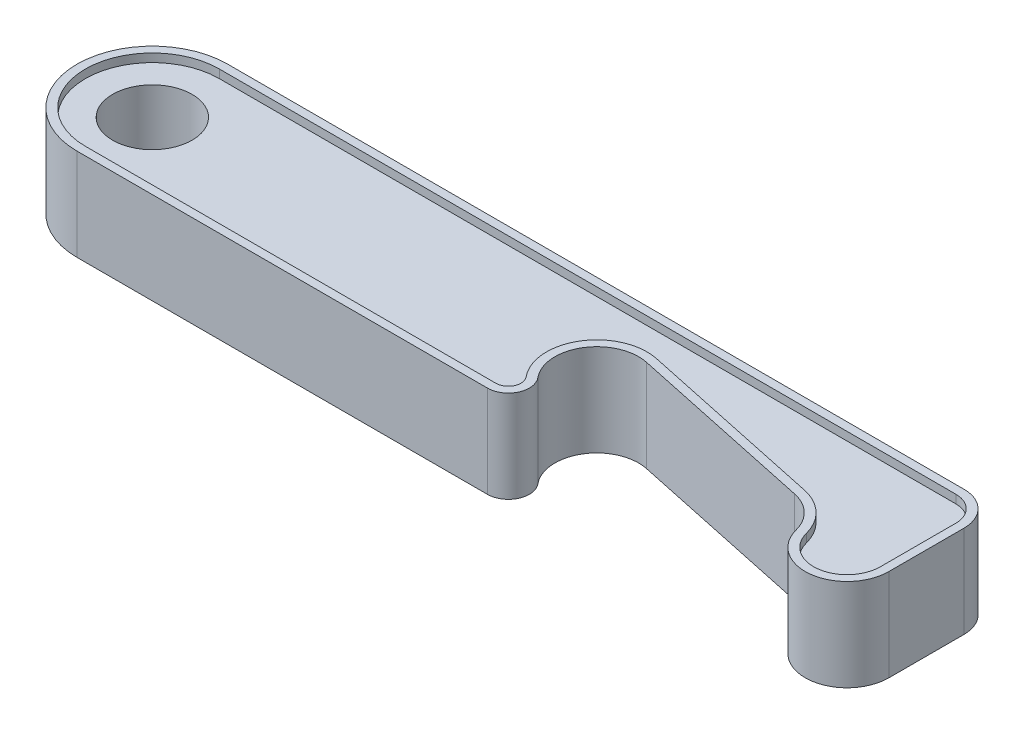
ISO-10303-21;
HEADER;
FILE_DESCRIPTION(('STEP AP214'),'2;1');
FILE_NAME('part.step','',(''),(''),'','','');
FILE_SCHEMA(('AUTOMOTIVE_DESIGN { 1 0 10303 214 1 1 1 1 }'));
ENDSEC;
DATA;
#1=APPLICATION_CONTEXT('core data for automotive mechanical design processes');
#2=APPLICATION_PROTOCOL_DEFINITION('international standard','automotive_design',2000,#1);
#3=PRODUCT_CONTEXT('',#1,'mechanical');
#4=PRODUCT('Part','Part','',(#3));
#5=PRODUCT_RELATED_PRODUCT_CATEGORY('part','',(#4));
#6=PRODUCT_DEFINITION_FORMATION('','',#4);
#7=PRODUCT_DEFINITION_CONTEXT('part definition',#1,'design');
#8=PRODUCT_DEFINITION('design','',#6,#7);
#9=PRODUCT_DEFINITION_SHAPE('','',#8);
#10=(LENGTH_UNIT() NAMED_UNIT(*) SI_UNIT(.MILLI.,.METRE.));
#11=(NAMED_UNIT(*) PLANE_ANGLE_UNIT() SI_UNIT($,.RADIAN.));
#12=(NAMED_UNIT(*) SI_UNIT($,.STERADIAN.) SOLID_ANGLE_UNIT());
#13=UNCERTAINTY_MEASURE_WITH_UNIT(LENGTH_MEASURE(1.E-05),#10,'distance_accuracy_value','');
#14=(GEOMETRIC_REPRESENTATION_CONTEXT(3) GLOBAL_UNCERTAINTY_ASSIGNED_CONTEXT((#13)) GLOBAL_UNIT_ASSIGNED_CONTEXT((#10,
#11,#12)) REPRESENTATION_CONTEXT('',''));
#15=CARTESIAN_POINT('',(0.,0.,0.));
#16=DIRECTION('',(0.,0.,1.));
#17=DIRECTION('',(1.,0.,0.));
#18=AXIS2_PLACEMENT_3D('',#15,#16,#17);
#19=CARTESIAN_POINT('',(0.,9.,0.));
#20=DIRECTION('',(0.,1.,0.));
#21=DIRECTION('',(0.,0.,1.));
#22=AXIS2_PLACEMENT_3D('',#19,#20,#21);
#23=PLANE('',#22);
#24=CARTESIAN_POINT('',(0.,9.,0.));
#25=DIRECTION('',(0.,1.,0.));
#26=DIRECTION('',(0.,0.,1.));
#27=AXIS2_PLACEMENT_3D('',#24,#25,#26);
#28=CIRCLE('',#27,8.);
#29=CARTESIAN_POINT('',(0.,9.,-8.));
#30=VERTEX_POINT('',#29);
#31=CARTESIAN_POINT('',(0.,9.,8.));
#32=VERTEX_POINT('',#31);
#33=EDGE_CURVE('E67',#30,#32,#28,.T.);
#34=ORIENTED_EDGE('',*,*,#33,.T.);
#35=DIRECTION('',(1.,0.,0.));
#36=VECTOR('',#35,1.);
#37=CARTESIAN_POINT('',(0.,9.,8.));
#38=LINE('',#37,#36);
#39=CARTESIAN_POINT('',(49.0402172346336,9.,8.));
#40=VERTEX_POINT('',#39);
#41=EDGE_CURVE('E428',#32,#40,#38,.T.);
#42=ORIENTED_EDGE('',*,*,#41,.T.);
#43=CARTESIAN_POINT('',(49.0402172346336,9.,6.5));
#44=DIRECTION('',(0.,1.,0.));
#45=DIRECTION('',(0.,0.,1.));
#46=AXIS2_PLACEMENT_3D('',#43,#44,#45);
#47=CIRCLE('',#46,1.5);
#48=CARTESIAN_POINT('',(50.1956821146032,9.,5.54349547248489));
#49=VERTEX_POINT('',#48);
#50=EDGE_CURVE('E431',#40,#49,#47,.T.);
#51=ORIENTED_EDGE('',*,*,#50,.T.);
#52=CARTESIAN_POINT('',(54.8175416344815,9.,1.71747736242449));
#53=DIRECTION('',(0.,-1.,0.));
#54=DIRECTION('',(0.,0.,1.));
#55=AXIS2_PLACEMENT_3D('',#52,#53,#54);
#56=CIRCLE('',#55,6.);
#57=CARTESIAN_POINT('',(56.065011779388,9.,-4.15140824197835));
#58=VERTEX_POINT('',#57);
#59=EDGE_CURVE('E434',#49,#58,#56,.T.);
#60=ORIENTED_EDGE('',*,*,#59,.T.);
#61=DIRECTION('',(0.978147600733805,0.,0.20791169081776));
#62=VECTOR('',#61,1.);
#63=CARTESIAN_POINT('',(56.065011779388,9.,-4.15140824197835));
#64=LINE('',#63,#62);
#65=CARTESIAN_POINT('',(78.565011779388,9.,0.631114395597159));
#66=VERTEX_POINT('',#65);
#67=EDGE_CURVE('E437',#58,#66,#64,.T.);
#68=ORIENTED_EDGE('',*,*,#67,.T.);
#69=CARTESIAN_POINT('',(77.3175416344815,9.,6.49999999999999));
#70=DIRECTION('',(0.,-1.,0.));
#71=DIRECTION('',(0.,0.,1.));
#72=AXIS2_PLACEMENT_3D('',#69,#70,#71);
#73=CIRCLE('',#72,6.);
#74=CARTESIAN_POINT('',(83.1270166537926,9.,4.99999999999999));
#75=VERTEX_POINT('',#74);
#76=EDGE_CURVE('E440',#66,#75,#73,.T.);
#77=ORIENTED_EDGE('',*,*,#76,.T.);
#78=CARTESIAN_POINT('',(87.,9.,4.));
#79=DIRECTION('',(0.,1.,0.));
#80=DIRECTION('',(0.,0.,1.));
#81=AXIS2_PLACEMENT_3D('',#78,#79,#80);
#82=CIRCLE('',#81,4.);
#83=CARTESIAN_POINT('',(91.,9.,4.));
#84=VERTEX_POINT('',#83);
#85=EDGE_CURVE('E443',#75,#84,#82,.T.);
#86=ORIENTED_EDGE('',*,*,#85,.T.);
#87=DIRECTION('',(0.,0.,-1.));
#88=VECTOR('',#87,1.);
#89=CARTESIAN_POINT('',(91.,9.,4.));
#90=LINE('',#89,#88);
#91=CARTESIAN_POINT('',(91.,9.,-5.));
#92=VERTEX_POINT('',#91);
#93=EDGE_CURVE('E446',#84,#92,#90,.T.);
#94=ORIENTED_EDGE('',*,*,#93,.T.);
#95=CARTESIAN_POINT('',(88.,9.,-5.));
#96=DIRECTION('',(0.,1.,0.));
#97=DIRECTION('',(0.,0.,1.));
#98=AXIS2_PLACEMENT_3D('',#95,#96,#97);
#99=CIRCLE('',#98,3.);
#100=CARTESIAN_POINT('',(88.,9.,-8.));
#101=VERTEX_POINT('',#100);
#102=EDGE_CURVE('E449',#92,#101,#99,.T.);
#103=ORIENTED_EDGE('',*,*,#102,.T.);
#104=DIRECTION('',(-1.,0.,0.));
#105=VECTOR('',#104,1.);
#106=CARTESIAN_POINT('',(88.,9.,-8.));
#107=LINE('',#106,#105);
#108=EDGE_CURVE('E397',#101,#30,#107,.T.);
#109=ORIENTED_EDGE('',*,*,#108,.T.);
#110=EDGE_LOOP('',(#34,#42,#51,#60,#68,#77,#86,#94,#103,#109));
#111=FACE_BOUND('',#110,.T.);
#112=CARTESIAN_POINT('',(0.,9.,0.));
#113=DIRECTION('',(0.,1.,0.));
#114=DIRECTION('',(0.,0.,1.));
#115=AXIS2_PLACEMENT_3D('',#112,#113,#114);
#116=CIRCLE('',#115,4.75);
#117=CARTESIAN_POINT('',(0.,9.,4.75));
#118=VERTEX_POINT('',#117);
#119=EDGE_CURVE('E534',#118,#118,#116,.T.);
#120=ORIENTED_EDGE('',*,*,#119,.F.);
#121=EDGE_LOOP('',(#120));
#122=FACE_BOUND('',#121,.T.);
#123=ADVANCED_FACE('F43',(#111,#122),#23,.T.);
#124=CARTESIAN_POINT('',(0.,0.,0.));
#125=DIRECTION('',(0.,1.,0.));
#126=DIRECTION('',(0.,0.,1.));
#127=AXIS2_PLACEMENT_3D('',#124,#125,#126);
#128=PLANE('',#127);
#129=DIRECTION('',(-1.,0.,0.));
#130=VECTOR('',#129,1.);
#131=CARTESIAN_POINT('',(49.0402172346336,0.,8.));
#132=LINE('',#131,#130);
#133=CARTESIAN_POINT('',(49.0402172346336,0.,8.));
#134=VERTEX_POINT('',#133);
#135=CARTESIAN_POINT('',(0.,0.,8.));
#136=VERTEX_POINT('',#135);
#137=EDGE_CURVE('E251',#134,#136,#132,.T.);
#138=ORIENTED_EDGE('',*,*,#137,.T.);
#139=CARTESIAN_POINT('',(0.,0.,0.));
#140=DIRECTION('',(0.,-1.,0.));
#141=DIRECTION('',(0.,0.,-1.));
#142=AXIS2_PLACEMENT_3D('',#139,#140,#141);
#143=CIRCLE('',#142,8.);
#144=CARTESIAN_POINT('',(0.,0.,-8.));
#145=VERTEX_POINT('',#144);
#146=EDGE_CURVE('E293',#136,#145,#143,.T.);
#147=ORIENTED_EDGE('',*,*,#146,.T.);
#148=DIRECTION('',(1.,0.,0.));
#149=VECTOR('',#148,1.);
#150=CARTESIAN_POINT('',(0.,0.,-8.));
#151=LINE('',#150,#149);
#152=CARTESIAN_POINT('',(88.,0.,-8.));
#153=VERTEX_POINT('',#152);
#154=EDGE_CURVE('E257',#145,#153,#151,.T.);
#155=ORIENTED_EDGE('',*,*,#154,.T.);
#156=CARTESIAN_POINT('',(88.,0.,-5.));
#157=DIRECTION('',(0.,-1.,0.));
#158=DIRECTION('',(0.,0.,-1.));
#159=AXIS2_PLACEMENT_3D('',#156,#157,#158);
#160=CIRCLE('',#159,3.);
#161=CARTESIAN_POINT('',(91.,0.,-5.));
#162=VERTEX_POINT('',#161);
#163=EDGE_CURVE('E298',#153,#162,#160,.T.);
#164=ORIENTED_EDGE('',*,*,#163,.T.);
#165=DIRECTION('',(0.,0.,1.));
#166=VECTOR('',#165,1.);
#167=CARTESIAN_POINT('',(91.,0.,-5.));
#168=LINE('',#167,#166);
#169=CARTESIAN_POINT('',(91.,0.,4.));
#170=VERTEX_POINT('',#169);
#171=EDGE_CURVE('E302',#162,#170,#168,.T.);
#172=ORIENTED_EDGE('',*,*,#171,.T.);
#173=CARTESIAN_POINT('',(87.,0.,4.));
#174=DIRECTION('',(0.,-1.,0.));
#175=DIRECTION('',(0.,0.,-1.));
#176=AXIS2_PLACEMENT_3D('',#173,#174,#175);
#177=CIRCLE('',#176,4.);
#178=CARTESIAN_POINT('',(83.1270166537926,0.,5.));
#179=VERTEX_POINT('',#178);
#180=EDGE_CURVE('E306',#170,#179,#177,.T.);
#181=ORIENTED_EDGE('',*,*,#180,.T.);
#182=CARTESIAN_POINT('',(77.3175416344815,0.,6.49999999999999));
#183=DIRECTION('',(0.,1.,0.));
#184=DIRECTION('',(0.,0.,-1.));
#185=AXIS2_PLACEMENT_3D('',#182,#183,#184);
#186=CIRCLE('',#185,5.99999999999999);
#187=CARTESIAN_POINT('',(78.565011779388,0.,0.631114395597162));
#188=VERTEX_POINT('',#187);
#189=EDGE_CURVE('E310',#179,#188,#186,.T.);
#190=ORIENTED_EDGE('',*,*,#189,.T.);
#191=DIRECTION('',(-0.978147600733805,0.,-0.20791169081776));
#192=VECTOR('',#191,1.);
#193=CARTESIAN_POINT('',(78.565011779388,0.,0.631114395597162));
#194=LINE('',#193,#192);
#195=CARTESIAN_POINT('',(56.065011779388,0.,-4.15140824197835));
#196=VERTEX_POINT('',#195);
#197=EDGE_CURVE('E314',#188,#196,#194,.T.);
#198=ORIENTED_EDGE('',*,*,#197,.T.);
#199=CARTESIAN_POINT('',(54.8175416344815,0.,1.71747736242449));
#200=DIRECTION('',(0.,1.,0.));
#201=DIRECTION('',(0.,0.,-1.));
#202=AXIS2_PLACEMENT_3D('',#199,#200,#201);
#203=CIRCLE('',#202,6.);
#204=CARTESIAN_POINT('',(50.1956821146032,0.,5.5434954724849));
#205=VERTEX_POINT('',#204);
#206=EDGE_CURVE('E318',#196,#205,#203,.T.);
#207=ORIENTED_EDGE('',*,*,#206,.T.);
#208=CARTESIAN_POINT('',(49.0402172346336,0.,6.5));
#209=DIRECTION('',(0.,-1.,0.));
#210=DIRECTION('',(0.,0.,-1.));
#211=AXIS2_PLACEMENT_3D('',#208,#209,#210);
#212=CIRCLE('',#211,1.5);
#213=EDGE_CURVE('E322',#205,#134,#212,.T.);
#214=ORIENTED_EDGE('',*,*,#213,.T.);
#215=EDGE_LOOP('',(#138,#147,#155,#164,#172,#181,#190,#198,#207,#214));
#216=FACE_BOUND('',#215,.T.);
#217=CARTESIAN_POINT('',(0.,0.,0.));
#218=DIRECTION('',(0.,1.,0.));
#219=DIRECTION('',(0.,0.,1.));
#220=AXIS2_PLACEMENT_3D('',#217,#218,#219);
#221=CIRCLE('',#220,4.75);
#222=CARTESIAN_POINT('',(0.,0.,4.75));
#223=VERTEX_POINT('',#222);
#224=EDGE_CURVE('E533',#223,#223,#221,.T.);
#225=ORIENTED_EDGE('',*,*,#224,.T.);
#226=EDGE_LOOP('',(#225));
#227=FACE_BOUND('',#226,.T.);
#228=ADVANCED_FACE('F617',(#216,#227),#128,.F.);
#229=CARTESIAN_POINT('',(0.,9.,0.));
#230=DIRECTION('',(0.,-1.,0.));
#231=DIRECTION('',(0.,0.,-1.));
#232=AXIS2_PLACEMENT_3D('',#229,#230,#231);
#233=CYLINDRICAL_SURFACE('',#232,9.);
#234=DIRECTION('',(0.,-1.,0.));
#235=VECTOR('',#234,1.);
#236=CARTESIAN_POINT('',(0.,9.,-9.));
#237=LINE('',#236,#235);
#238=CARTESIAN_POINT('',(0.,10.,-9.));
#239=VERTEX_POINT('',#238);
#240=CARTESIAN_POINT('',(0.,-1.,-9.));
#241=VERTEX_POINT('',#240);
#242=EDGE_CURVE('E538',#239,#241,#237,.T.);
#243=ORIENTED_EDGE('',*,*,#242,.T.);
#244=CARTESIAN_POINT('',(0.,-1.,0.));
#245=DIRECTION('',(0.,-1.,0.));
#246=DIRECTION('',(0.,0.,-1.));
#247=AXIS2_PLACEMENT_3D('',#244,#245,#246);
#248=CIRCLE('',#247,9.);
#249=CARTESIAN_POINT('',(0.,-1.,9.));
#250=VERTEX_POINT('',#249);
#251=EDGE_CURVE('E365',#250,#241,#248,.T.);
#252=ORIENTED_EDGE('',*,*,#251,.F.);
#253=DIRECTION('',(0.,-1.,0.));
#254=VECTOR('',#253,1.);
#255=CARTESIAN_POINT('',(0.,9.,9.));
#256=LINE('',#255,#254);
#257=CARTESIAN_POINT('',(0.,10.,9.));
#258=VERTEX_POINT('',#257);
#259=EDGE_CURVE('E11',#258,#250,#256,.T.);
#260=ORIENTED_EDGE('',*,*,#259,.F.);
#261=CARTESIAN_POINT('',(0.,10.,0.));
#262=DIRECTION('',(0.,1.,0.));
#263=DIRECTION('',(0.,0.,1.));
#264=AXIS2_PLACEMENT_3D('',#261,#262,#263);
#265=CIRCLE('',#264,9.);
#266=EDGE_CURVE('E501',#239,#258,#265,.T.);
#267=ORIENTED_EDGE('',*,*,#266,.F.);
#268=EDGE_LOOP('',(#243,#252,#260,#267));
#269=FACE_BOUND('',#268,.T.);
#270=ADVANCED_FACE('F45',(#269),#233,.T.);
#271=CARTESIAN_POINT('',(0.,9.,9.));
#272=DIRECTION('',(0.,0.,-1.));
#273=DIRECTION('',(-1.,0.,0.));
#274=AXIS2_PLACEMENT_3D('',#271,#272,#273);
#275=PLANE('',#274);
#276=ORIENTED_EDGE('',*,*,#259,.T.);
#277=DIRECTION('',(-1.,0.,0.));
#278=VECTOR('',#277,1.);
#279=CARTESIAN_POINT('',(0.,-1.,9.));
#280=LINE('',#279,#278);
#281=CARTESIAN_POINT('',(49.0402172346336,-1.,9.));
#282=VERTEX_POINT('',#281);
#283=EDGE_CURVE('E361',#282,#250,#280,.T.);
#284=ORIENTED_EDGE('',*,*,#283,.F.);
#285=DIRECTION('',(0.,-1.,0.));
#286=VECTOR('',#285,1.);
#287=CARTESIAN_POINT('',(49.0402172346336,9.,9.));
#288=LINE('',#287,#286);
#289=CARTESIAN_POINT('',(49.0402172346336,10.,9.));
#290=VERTEX_POINT('',#289);
#291=EDGE_CURVE('E52',#290,#282,#288,.T.);
#292=ORIENTED_EDGE('',*,*,#291,.F.);
#293=DIRECTION('',(1.,0.,0.));
#294=VECTOR('',#293,1.);
#295=CARTESIAN_POINT('',(0.,10.,9.));
#296=LINE('',#295,#294);
#297=EDGE_CURVE('E505',#258,#290,#296,.T.);
#298=ORIENTED_EDGE('',*,*,#297,.F.);
#299=EDGE_LOOP('',(#276,#284,#292,#298));
#300=FACE_BOUND('',#299,.T.);
#301=ADVANCED_FACE('F575',(#300),#275,.F.);
#302=CARTESIAN_POINT('',(49.0402172346336,9.,6.5));
#303=DIRECTION('',(0.,-1.,0.));
#304=DIRECTION('',(0.,0.,-1.));
#305=AXIS2_PLACEMENT_3D('',#302,#303,#304);
#306=CYLINDRICAL_SURFACE('',#305,2.5);
#307=ORIENTED_EDGE('',*,*,#291,.T.);
#308=CARTESIAN_POINT('',(49.0402172346336,-1.,6.5));
#309=DIRECTION('',(0.,-1.,0.));
#310=DIRECTION('',(0.,0.,-1.));
#311=AXIS2_PLACEMENT_3D('',#308,#309,#310);
#312=CIRCLE('',#311,2.5);
#313=CARTESIAN_POINT('',(50.9659920345829,-1.,4.90582578747483));
#314=VERTEX_POINT('',#313);
#315=EDGE_CURVE('E357',#314,#282,#312,.T.);
#316=ORIENTED_EDGE('',*,*,#315,.F.);
#317=DIRECTION('',(0.,-1.,0.));
#318=VECTOR('',#317,1.);
#319=CARTESIAN_POINT('',(50.9659920345829,9.,4.90582578747483));
#320=LINE('',#319,#318);
#321=CARTESIAN_POINT('',(50.9659920345829,10.,4.90582578747483));
#322=VERTEX_POINT('',#321);
#323=EDGE_CURVE('E562',#322,#314,#320,.T.);
#324=ORIENTED_EDGE('',*,*,#323,.F.);
#325=CARTESIAN_POINT('',(49.0402172346336,10.,6.5));
#326=DIRECTION('',(0.,1.,0.));
#327=DIRECTION('',(0.,0.,1.));
#328=AXIS2_PLACEMENT_3D('',#325,#326,#327);
#329=CIRCLE('',#328,2.5);
#330=EDGE_CURVE('E509',#290,#322,#329,.T.);
#331=ORIENTED_EDGE('',*,*,#330,.F.);
#332=EDGE_LOOP('',(#307,#316,#324,#331));
#333=FACE_BOUND('',#332,.T.);
#334=ADVANCED_FACE('F568',(#333),#306,.T.);
#335=CARTESIAN_POINT('',(54.8175416344815,9.,1.71747736242449));
#336=DIRECTION('',(0.,-1.,0.));
#337=DIRECTION('',(0.,0.,-1.));
#338=AXIS2_PLACEMENT_3D('',#335,#336,#337);
#339=CYLINDRICAL_SURFACE('',#338,5.);
#340=ORIENTED_EDGE('',*,*,#323,.T.);
#341=CARTESIAN_POINT('',(54.8175416344815,-1.,1.71747736242449));
#342=DIRECTION('',(0.,1.,0.));
#343=DIRECTION('',(0.,0.,-1.));
#344=AXIS2_PLACEMENT_3D('',#341,#342,#343);
#345=CIRCLE('',#344,5.);
#346=CARTESIAN_POINT('',(55.8571000885703,-1.,-3.17326064124454));
#347=VERTEX_POINT('',#346);
#348=EDGE_CURVE('E259',#347,#314,#345,.T.);
#349=ORIENTED_EDGE('',*,*,#348,.F.);
#350=DIRECTION('',(0.,-1.,0.));
#351=VECTOR('',#350,1.);
#352=CARTESIAN_POINT('',(55.8571000885703,9.,-3.17326064124454));
#353=LINE('',#352,#351);
#354=CARTESIAN_POINT('',(55.8571000885703,10.,-3.17326064124454));
#355=VERTEX_POINT('',#354);
#356=EDGE_CURVE('E559',#355,#347,#353,.T.);
#357=ORIENTED_EDGE('',*,*,#356,.F.);
#358=CARTESIAN_POINT('',(54.8175416344815,10.,1.71747736242449));
#359=DIRECTION('',(0.,-1.,0.));
#360=DIRECTION('',(0.,0.,1.));
#361=AXIS2_PLACEMENT_3D('',#358,#359,#360);
#362=CIRCLE('',#361,5.);
#363=EDGE_CURVE('E513',#322,#355,#362,.T.);
#364=ORIENTED_EDGE('',*,*,#363,.F.);
#365=EDGE_LOOP('',(#340,#349,#357,#364));
#366=FACE_BOUND('',#365,.T.);
#367=ADVANCED_FACE('F607',(#366),#339,.F.);
#368=CARTESIAN_POINT('',(55.8571000885703,9.,-3.17326064124454));
#369=DIRECTION('',(0.20791169081776,0.,-0.978147600733806));
#370=DIRECTION('',(-0.978147600733806,0.,-0.20791169081776));
#371=AXIS2_PLACEMENT_3D('',#368,#369,#370);
#372=PLANE('',#371);
#373=ORIENTED_EDGE('',*,*,#356,.T.);
#374=DIRECTION('',(-0.978147600733805,0.,-0.20791169081776));
#375=VECTOR('',#374,1.);
#376=CARTESIAN_POINT('',(55.8571000885703,-1.,-3.17326064124454));
#377=LINE('',#376,#375);
#378=CARTESIAN_POINT('',(78.3571000885703,-1.,1.60926199633097));
#379=VERTEX_POINT('',#378);
#380=EDGE_CURVE('E389',#379,#347,#377,.T.);
#381=ORIENTED_EDGE('',*,*,#380,.F.);
#382=DIRECTION('',(0.,-1.,0.));
#383=VECTOR('',#382,1.);
#384=CARTESIAN_POINT('',(78.3571000885703,9.,1.60926199633097));
#385=LINE('',#384,#383);
#386=CARTESIAN_POINT('',(78.3571000885703,10.,1.60926199633097));
#387=VERTEX_POINT('',#386);
#388=EDGE_CURVE('E556',#387,#379,#385,.T.);
#389=ORIENTED_EDGE('',*,*,#388,.F.);
#390=DIRECTION('',(0.978147600733805,0.,0.20791169081776));
#391=VECTOR('',#390,1.);
#392=CARTESIAN_POINT('',(55.8571000885703,10.,-3.17326064124454));
#393=LINE('',#392,#391);
#394=EDGE_CURVE('E517',#355,#387,#393,.T.);
#395=ORIENTED_EDGE('',*,*,#394,.F.);
#396=EDGE_LOOP('',(#373,#381,#389,#395));
#397=FACE_BOUND('',#396,.T.);
#398=ADVANCED_FACE('F604',(#397),#372,.F.);
#399=CARTESIAN_POINT('',(77.3175416344815,9.,6.49999999999999));
#400=DIRECTION('',(0.,-1.,0.));
#401=DIRECTION('',(0.,0.,-1.));
#402=AXIS2_PLACEMENT_3D('',#399,#400,#401);
#403=CYLINDRICAL_SURFACE('',#402,5.);
#404=ORIENTED_EDGE('',*,*,#388,.T.);
#405=CARTESIAN_POINT('',(77.3175416344815,-1.,6.49999999999999));
#406=DIRECTION('',(0.,1.,0.));
#407=DIRECTION('',(0.,0.,-1.));
#408=AXIS2_PLACEMENT_3D('',#405,#406,#407);
#409=CIRCLE('',#408,5.);
#410=CARTESIAN_POINT('',(82.1587708172407,-1.,5.25));
#411=VERTEX_POINT('',#410);
#412=EDGE_CURVE('E385',#411,#379,#409,.T.);
#413=ORIENTED_EDGE('',*,*,#412,.F.);
#414=DIRECTION('',(0.,-1.,0.));
#415=VECTOR('',#414,1.);
#416=CARTESIAN_POINT('',(82.1587708172407,9.,5.25));
#417=LINE('',#416,#415);
#418=CARTESIAN_POINT('',(82.1587708172407,10.,5.25));
#419=VERTEX_POINT('',#418);
#420=EDGE_CURVE('E553',#419,#411,#417,.T.);
#421=ORIENTED_EDGE('',*,*,#420,.F.);
#422=CARTESIAN_POINT('',(77.3175416344815,10.,6.49999999999999));
#423=DIRECTION('',(0.,-1.,0.));
#424=DIRECTION('',(0.,0.,1.));
#425=AXIS2_PLACEMENT_3D('',#422,#423,#424);
#426=CIRCLE('',#425,5.);
#427=EDGE_CURVE('E521',#387,#419,#426,.T.);
#428=ORIENTED_EDGE('',*,*,#427,.F.);
#429=EDGE_LOOP('',(#404,#413,#421,#428));
#430=FACE_BOUND('',#429,.T.);
#431=ADVANCED_FACE('F601',(#430),#403,.F.);
#432=CARTESIAN_POINT('',(87.,9.,4.));
#433=DIRECTION('',(0.,-1.,0.));
#434=DIRECTION('',(0.,0.,-1.));
#435=AXIS2_PLACEMENT_3D('',#432,#433,#434);
#436=CYLINDRICAL_SURFACE('',#435,5.);
#437=ORIENTED_EDGE('',*,*,#420,.T.);
#438=CARTESIAN_POINT('',(87.,-1.,4.));
#439=DIRECTION('',(0.,-1.,0.));
#440=DIRECTION('',(0.,0.,-1.));
#441=AXIS2_PLACEMENT_3D('',#438,#439,#440);
#442=CIRCLE('',#441,5.);
#443=CARTESIAN_POINT('',(92.,-1.,4.));
#444=VERTEX_POINT('',#443);
#445=EDGE_CURVE('E381',#444,#411,#442,.T.);
#446=ORIENTED_EDGE('',*,*,#445,.F.);
#447=DIRECTION('',(0.,-1.,0.));
#448=VECTOR('',#447,1.);
#449=CARTESIAN_POINT('',(92.,9.,4.));
#450=LINE('',#449,#448);
#451=CARTESIAN_POINT('',(92.,10.,4.));
#452=VERTEX_POINT('',#451);
#453=EDGE_CURVE('E550',#452,#444,#450,.T.);
#454=ORIENTED_EDGE('',*,*,#453,.F.);
#455=CARTESIAN_POINT('',(87.,10.,4.));
#456=DIRECTION('',(0.,1.,0.));
#457=DIRECTION('',(0.,0.,1.));
#458=AXIS2_PLACEMENT_3D('',#455,#456,#457);
#459=CIRCLE('',#458,5.);
#460=EDGE_CURVE('E525',#419,#452,#459,.T.);
#461=ORIENTED_EDGE('',*,*,#460,.F.);
#462=EDGE_LOOP('',(#437,#446,#454,#461));
#463=FACE_BOUND('',#462,.T.);
#464=ADVANCED_FACE('F596',(#463),#436,.T.);
#465=CARTESIAN_POINT('',(92.,9.,-5.));
#466=DIRECTION('',(-1.,0.,0.));
#467=DIRECTION('',(0.,0.,1.));
#468=AXIS2_PLACEMENT_3D('',#465,#466,#467);
#469=PLANE('',#468);
#470=ORIENTED_EDGE('',*,*,#453,.T.);
#471=DIRECTION('',(0.,0.,1.));
#472=VECTOR('',#471,1.);
#473=CARTESIAN_POINT('',(92.,-1.,4.));
#474=LINE('',#473,#472);
#475=CARTESIAN_POINT('',(92.,-1.,-5.));
#476=VERTEX_POINT('',#475);
#477=EDGE_CURVE('E377',#476,#444,#474,.T.);
#478=ORIENTED_EDGE('',*,*,#477,.F.);
#479=DIRECTION('',(0.,-1.,0.));
#480=VECTOR('',#479,1.);
#481=CARTESIAN_POINT('',(92.,9.,-5.));
#482=LINE('',#481,#480);
#483=CARTESIAN_POINT('',(92.,10.,-5.));
#484=VERTEX_POINT('',#483);
#485=EDGE_CURVE('E547',#484,#476,#482,.T.);
#486=ORIENTED_EDGE('',*,*,#485,.F.);
#487=DIRECTION('',(0.,0.,-1.));
#488=VECTOR('',#487,1.);
#489=CARTESIAN_POINT('',(92.,10.,4.));
#490=LINE('',#489,#488);
#491=EDGE_CURVE('E529',#452,#484,#490,.T.);
#492=ORIENTED_EDGE('',*,*,#491,.F.);
#493=EDGE_LOOP('',(#470,#478,#486,#492));
#494=FACE_BOUND('',#493,.T.);
#495=ADVANCED_FACE('F592',(#494),#469,.F.);
#496=CARTESIAN_POINT('',(88.,9.,-5.));
#497=DIRECTION('',(0.,-1.,0.));
#498=DIRECTION('',(0.,0.,-1.));
#499=AXIS2_PLACEMENT_3D('',#496,#497,#498);
#500=CYLINDRICAL_SURFACE('',#499,4.);
#501=ORIENTED_EDGE('',*,*,#485,.T.);
#502=CARTESIAN_POINT('',(88.,-1.,-5.));
#503=DIRECTION('',(0.,-1.,0.));
#504=DIRECTION('',(0.,0.,-1.));
#505=AXIS2_PLACEMENT_3D('',#502,#503,#504);
#506=CIRCLE('',#505,4.);
#507=CARTESIAN_POINT('',(88.,-1.,-9.));
#508=VERTEX_POINT('',#507);
#509=EDGE_CURVE('E373',#508,#476,#506,.T.);
#510=ORIENTED_EDGE('',*,*,#509,.F.);
#511=DIRECTION('',(0.,-1.,0.));
#512=VECTOR('',#511,1.);
#513=CARTESIAN_POINT('',(88.,9.,-9.));
#514=LINE('',#513,#512);
#515=CARTESIAN_POINT('',(88.,10.,-9.));
#516=VERTEX_POINT('',#515);
#517=EDGE_CURVE('E544',#516,#508,#514,.T.);
#518=ORIENTED_EDGE('',*,*,#517,.F.);
#519=CARTESIAN_POINT('',(88.,10.,-5.));
#520=DIRECTION('',(0.,1.,0.));
#521=DIRECTION('',(0.,0.,1.));
#522=AXIS2_PLACEMENT_3D('',#519,#520,#521);
#523=CIRCLE('',#522,4.);
#524=EDGE_CURVE('E493',#484,#516,#523,.T.);
#525=ORIENTED_EDGE('',*,*,#524,.F.);
#526=EDGE_LOOP('',(#501,#510,#518,#525));
#527=FACE_BOUND('',#526,.T.);
#528=ADVANCED_FACE('F589',(#527),#500,.T.);
#529=CARTESIAN_POINT('',(0.,9.,-9.));
#530=DIRECTION('',(0.,0.,1.));
#531=DIRECTION('',(1.,0.,0.));
#532=AXIS2_PLACEMENT_3D('',#529,#530,#531);
#533=PLANE('',#532);
#534=ORIENTED_EDGE('',*,*,#517,.T.);
#535=DIRECTION('',(1.,0.,0.));
#536=VECTOR('',#535,1.);
#537=CARTESIAN_POINT('',(88.,-1.,-9.));
#538=LINE('',#537,#536);
#539=EDGE_CURVE('E369',#241,#508,#538,.T.);
#540=ORIENTED_EDGE('',*,*,#539,.F.);
#541=ORIENTED_EDGE('',*,*,#242,.F.);
#542=DIRECTION('',(-1.,0.,0.));
#543=VECTOR('',#542,1.);
#544=CARTESIAN_POINT('',(88.,10.,-9.));
#545=LINE('',#544,#543);
#546=EDGE_CURVE('E497',#516,#239,#545,.T.);
#547=ORIENTED_EDGE('',*,*,#546,.F.);
#548=EDGE_LOOP('',(#534,#540,#541,#547));
#549=FACE_BOUND('',#548,.T.);
#550=ADVANCED_FACE('F584',(#549),#533,.F.);
#551=CARTESIAN_POINT('',(0.,9.,0.));
#552=DIRECTION('',(0.,-1.,0.));
#553=DIRECTION('',(0.,0.,-1.));
#554=AXIS2_PLACEMENT_3D('',#551,#552,#553);
#555=CYLINDRICAL_SURFACE('',#554,4.75);
#556=ORIENTED_EDGE('',*,*,#119,.T.);
#557=EDGE_LOOP('',(#556));
#558=FACE_BOUND('',#557,.T.);
#559=ORIENTED_EDGE('',*,*,#224,.F.);
#560=EDGE_LOOP('',(#559));
#561=FACE_BOUND('',#560,.T.);
#562=ADVANCED_FACE('F626',(#558,#561),#555,.F.);
#563=CARTESIAN_POINT('',(88.,10.,-5.));
#564=DIRECTION('',(0.,1.,0.));
#565=DIRECTION('',(0.,0.,1.));
#566=AXIS2_PLACEMENT_3D('',#563,#564,#565);
#567=PLANE('',#566);
#568=ORIENTED_EDGE('',*,*,#524,.T.);
#569=ORIENTED_EDGE('',*,*,#546,.T.);
#570=ORIENTED_EDGE('',*,*,#266,.T.);
#571=ORIENTED_EDGE('',*,*,#297,.T.);
#572=ORIENTED_EDGE('',*,*,#330,.T.);
#573=ORIENTED_EDGE('',*,*,#363,.T.);
#574=ORIENTED_EDGE('',*,*,#394,.T.);
#575=ORIENTED_EDGE('',*,*,#427,.T.);
#576=ORIENTED_EDGE('',*,*,#460,.T.);
#577=ORIENTED_EDGE('',*,*,#491,.T.);
#578=EDGE_LOOP('',(#568,#569,#570,#571,#572,#573,#574,#575,#576,#577));
#579=FACE_BOUND('',#578,.T.);
#580=DIRECTION('',(1.,0.,0.));
#581=VECTOR('',#580,1.);
#582=CARTESIAN_POINT('',(0.,10.,8.));
#583=LINE('',#582,#581);
#584=CARTESIAN_POINT('',(0.,10.,8.));
#585=VERTEX_POINT('',#584);
#586=CARTESIAN_POINT('',(49.0402172346336,10.,8.));
#587=VERTEX_POINT('',#586);
#588=EDGE_CURVE('E396',#585,#587,#583,.T.);
#589=ORIENTED_EDGE('',*,*,#588,.F.);
#590=CARTESIAN_POINT('',(0.,10.,0.));
#591=DIRECTION('',(0.,1.,0.));
#592=DIRECTION('',(0.,0.,1.));
#593=AXIS2_PLACEMENT_3D('',#590,#591,#592);
#594=CIRCLE('',#593,8.);
#595=CARTESIAN_POINT('',(0.,10.,-8.));
#596=VERTEX_POINT('',#595);
#597=EDGE_CURVE('E393',#596,#585,#594,.T.);
#598=ORIENTED_EDGE('',*,*,#597,.F.);
#599=DIRECTION('',(-1.,0.,0.));
#600=VECTOR('',#599,1.);
#601=CARTESIAN_POINT('',(88.,10.,-8.));
#602=LINE('',#601,#600);
#603=CARTESIAN_POINT('',(88.,10.,-8.));
#604=VERTEX_POINT('',#603);
#605=EDGE_CURVE('E422',#604,#596,#602,.T.);
#606=ORIENTED_EDGE('',*,*,#605,.F.);
#607=CARTESIAN_POINT('',(88.,10.,-5.));
#608=DIRECTION('',(0.,1.,0.));
#609=DIRECTION('',(0.,0.,1.));
#610=AXIS2_PLACEMENT_3D('',#607,#608,#609);
#611=CIRCLE('',#610,3.);
#612=CARTESIAN_POINT('',(91.,10.,-5.));
#613=VERTEX_POINT('',#612);
#614=EDGE_CURVE('E418',#613,#604,#611,.T.);
#615=ORIENTED_EDGE('',*,*,#614,.F.);
#616=DIRECTION('',(0.,0.,-1.));
#617=VECTOR('',#616,1.);
#618=CARTESIAN_POINT('',(91.,10.,4.));
#619=LINE('',#618,#617);
#620=CARTESIAN_POINT('',(91.,10.,4.));
#621=VERTEX_POINT('',#620);
#622=EDGE_CURVE('E415',#621,#613,#619,.T.);
#623=ORIENTED_EDGE('',*,*,#622,.F.);
#624=CARTESIAN_POINT('',(87.,10.,4.));
#625=DIRECTION('',(0.,1.,0.));
#626=DIRECTION('',(0.,0.,1.));
#627=AXIS2_PLACEMENT_3D('',#624,#625,#626);
#628=CIRCLE('',#627,4.);
#629=CARTESIAN_POINT('',(83.1270166537926,10.,4.99999999999999));
#630=VERTEX_POINT('',#629);
#631=EDGE_CURVE('E412',#630,#621,#628,.T.);
#632=ORIENTED_EDGE('',*,*,#631,.F.);
#633=CARTESIAN_POINT('',(77.3175416344815,10.,6.49999999999999));
#634=DIRECTION('',(0.,-1.,0.));
#635=DIRECTION('',(0.,0.,1.));
#636=AXIS2_PLACEMENT_3D('',#633,#634,#635);
#637=CIRCLE('',#636,6.);
#638=CARTESIAN_POINT('',(78.565011779388,10.,0.63111439559716));
#639=VERTEX_POINT('',#638);
#640=EDGE_CURVE('E409',#639,#630,#637,.T.);
#641=ORIENTED_EDGE('',*,*,#640,.F.);
#642=DIRECTION('',(0.978147600733805,0.,0.20791169081776));
#643=VECTOR('',#642,1.);
#644=CARTESIAN_POINT('',(56.065011779388,10.,-4.15140824197835));
#645=LINE('',#644,#643);
#646=CARTESIAN_POINT('',(56.065011779388,10.,-4.15140824197835));
#647=VERTEX_POINT('',#646);
#648=EDGE_CURVE('E406',#647,#639,#645,.T.);
#649=ORIENTED_EDGE('',*,*,#648,.F.);
#650=CARTESIAN_POINT('',(54.8175416344815,10.,1.71747736242449));
#651=DIRECTION('',(0.,-1.,0.));
#652=DIRECTION('',(0.,0.,1.));
#653=AXIS2_PLACEMENT_3D('',#650,#651,#652);
#654=CIRCLE('',#653,6.);
#655=CARTESIAN_POINT('',(50.1956821146032,10.,5.54349547248489));
#656=VERTEX_POINT('',#655);
#657=EDGE_CURVE('E403',#656,#647,#654,.T.);
#658=ORIENTED_EDGE('',*,*,#657,.F.);
#659=CARTESIAN_POINT('',(49.0402172346336,10.,6.5));
#660=DIRECTION('',(0.,1.,0.));
#661=DIRECTION('',(0.,0.,1.));
#662=AXIS2_PLACEMENT_3D('',#659,#660,#661);
#663=CIRCLE('',#662,1.5);
#664=EDGE_CURVE('E400',#587,#656,#663,.T.);
#665=ORIENTED_EDGE('',*,*,#664,.F.);
#666=EDGE_LOOP('',(#589,#598,#606,#615,#623,#632,#641,#649,#658,#665));
#667=FACE_BOUND('',#666,.T.);
#668=ADVANCED_FACE('F579',(#579,#667),#567,.T.);
#669=CARTESIAN_POINT('',(0.,10.,0.));
#670=DIRECTION('',(0.,-1.,0.));
#671=DIRECTION('',(0.,0.,-1.));
#672=AXIS2_PLACEMENT_3D('',#669,#670,#671);
#673=CYLINDRICAL_SURFACE('',#672,8.);
#674=ORIENTED_EDGE('',*,*,#33,.F.);
#675=DIRECTION('',(0.,-1.,0.));
#676=VECTOR('',#675,1.);
#677=CARTESIAN_POINT('',(0.,10.,-8.));
#678=LINE('',#677,#676);
#679=EDGE_CURVE('E425',#596,#30,#678,.T.);
#680=ORIENTED_EDGE('',*,*,#679,.F.);
#681=ORIENTED_EDGE('',*,*,#597,.T.);
#682=DIRECTION('',(0.,-1.,0.));
#683=VECTOR('',#682,1.);
#684=CARTESIAN_POINT('',(0.,10.,8.));
#685=LINE('',#684,#683);
#686=EDGE_CURVE('E489',#585,#32,#685,.T.);
#687=ORIENTED_EDGE('',*,*,#686,.T.);
#688=EDGE_LOOP('',(#674,#680,#681,#687));
#689=FACE_BOUND('',#688,.T.);
#690=ADVANCED_FACE('F671',(#689),#673,.F.);
#691=CARTESIAN_POINT('',(0.,10.,8.));
#692=DIRECTION('',(0.,0.,-1.));
#693=DIRECTION('',(-1.,0.,0.));
#694=AXIS2_PLACEMENT_3D('',#691,#692,#693);
#695=PLANE('',#694);
#696=ORIENTED_EDGE('',*,*,#41,.F.);
#697=ORIENTED_EDGE('',*,*,#686,.F.);
#698=ORIENTED_EDGE('',*,*,#588,.T.);
#699=DIRECTION('',(0.,-1.,0.));
#700=VECTOR('',#699,1.);
#701=CARTESIAN_POINT('',(49.0402172346336,10.,8.));
#702=LINE('',#701,#700);
#703=EDGE_CURVE('E485',#587,#40,#702,.T.);
#704=ORIENTED_EDGE('',*,*,#703,.T.);
#705=EDGE_LOOP('',(#696,#697,#698,#704));
#706=FACE_BOUND('',#705,.T.);
#707=ADVANCED_FACE('F677',(#706),#695,.T.);
#708=CARTESIAN_POINT('',(49.0402172346336,10.,6.5));
#709=DIRECTION('',(0.,-1.,0.));
#710=DIRECTION('',(0.,0.,-1.));
#711=AXIS2_PLACEMENT_3D('',#708,#709,#710);
#712=CYLINDRICAL_SURFACE('',#711,1.5);
#713=ORIENTED_EDGE('',*,*,#50,.F.);
#714=ORIENTED_EDGE('',*,*,#703,.F.);
#715=ORIENTED_EDGE('',*,*,#664,.T.);
#716=DIRECTION('',(0.,-1.,0.));
#717=VECTOR('',#716,1.);
#718=CARTESIAN_POINT('',(50.1956821146032,10.,5.54349547248489));
#719=LINE('',#718,#717);
#720=EDGE_CURVE('E481',#656,#49,#719,.T.);
#721=ORIENTED_EDGE('',*,*,#720,.T.);
#722=EDGE_LOOP('',(#713,#714,#715,#721));
#723=FACE_BOUND('',#722,.T.);
#724=ADVANCED_FACE('F685',(#723),#712,.F.);
#725=CARTESIAN_POINT('',(54.8175416344815,10.,1.71747736242449));
#726=DIRECTION('',(0.,-1.,0.));
#727=DIRECTION('',(0.,0.,-1.));
#728=AXIS2_PLACEMENT_3D('',#725,#726,#727);
#729=CYLINDRICAL_SURFACE('',#728,6.);
#730=ORIENTED_EDGE('',*,*,#59,.F.);
#731=ORIENTED_EDGE('',*,*,#720,.F.);
#732=ORIENTED_EDGE('',*,*,#657,.T.);
#733=DIRECTION('',(0.,-1.,0.));
#734=VECTOR('',#733,1.);
#735=CARTESIAN_POINT('',(56.065011779388,10.,-4.15140824197835));
#736=LINE('',#735,#734);
#737=EDGE_CURVE('E477',#647,#58,#736,.T.);
#738=ORIENTED_EDGE('',*,*,#737,.T.);
#739=EDGE_LOOP('',(#730,#731,#732,#738));
#740=FACE_BOUND('',#739,.T.);
#741=ADVANCED_FACE('F693',(#740),#729,.T.);
#742=CARTESIAN_POINT('',(56.065011779388,10.,-4.15140824197835));
#743=DIRECTION('',(0.20791169081776,0.,-0.978147600733806));
#744=DIRECTION('',(-0.978147600733806,0.,-0.20791169081776));
#745=AXIS2_PLACEMENT_3D('',#742,#743,#744);
#746=PLANE('',#745);
#747=ORIENTED_EDGE('',*,*,#67,.F.);
#748=ORIENTED_EDGE('',*,*,#737,.F.);
#749=ORIENTED_EDGE('',*,*,#648,.T.);
#750=DIRECTION('',(0.,-1.,0.));
#751=VECTOR('',#750,1.);
#752=CARTESIAN_POINT('',(78.565011779388,10.,0.63111439559716));
#753=LINE('',#752,#751);
#754=EDGE_CURVE('E473',#639,#66,#753,.T.);
#755=ORIENTED_EDGE('',*,*,#754,.T.);
#756=EDGE_LOOP('',(#747,#748,#749,#755));
#757=FACE_BOUND('',#756,.T.);
#758=ADVANCED_FACE('F701',(#757),#746,.T.);
#759=CARTESIAN_POINT('',(77.3175416344815,10.,6.49999999999999));
#760=DIRECTION('',(0.,-1.,0.));
#761=DIRECTION('',(0.,0.,-1.));
#762=AXIS2_PLACEMENT_3D('',#759,#760,#761);
#763=CYLINDRICAL_SURFACE('',#762,6.);
#764=ORIENTED_EDGE('',*,*,#76,.F.);
#765=ORIENTED_EDGE('',*,*,#754,.F.);
#766=ORIENTED_EDGE('',*,*,#640,.T.);
#767=DIRECTION('',(0.,-1.,0.));
#768=VECTOR('',#767,1.);
#769=CARTESIAN_POINT('',(83.1270166537926,10.,4.99999999999999));
#770=LINE('',#769,#768);
#771=EDGE_CURVE('E469',#630,#75,#770,.T.);
#772=ORIENTED_EDGE('',*,*,#771,.T.);
#773=EDGE_LOOP('',(#764,#765,#766,#772));
#774=FACE_BOUND('',#773,.T.);
#775=ADVANCED_FACE('F709',(#774),#763,.T.);
#776=CARTESIAN_POINT('',(87.,10.,4.));
#777=DIRECTION('',(0.,-1.,0.));
#778=DIRECTION('',(0.,0.,-1.));
#779=AXIS2_PLACEMENT_3D('',#776,#777,#778);
#780=CYLINDRICAL_SURFACE('',#779,4.);
#781=ORIENTED_EDGE('',*,*,#85,.F.);
#782=ORIENTED_EDGE('',*,*,#771,.F.);
#783=ORIENTED_EDGE('',*,*,#631,.T.);
#784=DIRECTION('',(0.,-1.,0.));
#785=VECTOR('',#784,1.);
#786=CARTESIAN_POINT('',(91.,10.,4.));
#787=LINE('',#786,#785);
#788=EDGE_CURVE('E465',#621,#84,#787,.T.);
#789=ORIENTED_EDGE('',*,*,#788,.T.);
#790=EDGE_LOOP('',(#781,#782,#783,#789));
#791=FACE_BOUND('',#790,.T.);
#792=ADVANCED_FACE('F717',(#791),#780,.F.);
#793=CARTESIAN_POINT('',(91.,10.,4.));
#794=DIRECTION('',(-1.,0.,0.));
#795=DIRECTION('',(0.,0.,1.));
#796=AXIS2_PLACEMENT_3D('',#793,#794,#795);
#797=PLANE('',#796);
#798=ORIENTED_EDGE('',*,*,#93,.F.);
#799=ORIENTED_EDGE('',*,*,#788,.F.);
#800=ORIENTED_EDGE('',*,*,#622,.T.);
#801=DIRECTION('',(0.,-1.,0.));
#802=VECTOR('',#801,1.);
#803=CARTESIAN_POINT('',(91.,10.,-5.));
#804=LINE('',#803,#802);
#805=EDGE_CURVE('E461',#613,#92,#804,.T.);
#806=ORIENTED_EDGE('',*,*,#805,.T.);
#807=EDGE_LOOP('',(#798,#799,#800,#806));
#808=FACE_BOUND('',#807,.T.);
#809=ADVANCED_FACE('F725',(#808),#797,.T.);
#810=CARTESIAN_POINT('',(88.,10.,-5.));
#811=DIRECTION('',(0.,-1.,0.));
#812=DIRECTION('',(0.,0.,-1.));
#813=AXIS2_PLACEMENT_3D('',#810,#811,#812);
#814=CYLINDRICAL_SURFACE('',#813,3.);
#815=ORIENTED_EDGE('',*,*,#102,.F.);
#816=ORIENTED_EDGE('',*,*,#805,.F.);
#817=ORIENTED_EDGE('',*,*,#614,.T.);
#818=DIRECTION('',(0.,-1.,0.));
#819=VECTOR('',#818,1.);
#820=CARTESIAN_POINT('',(88.,10.,-8.));
#821=LINE('',#820,#819);
#822=EDGE_CURVE('E457',#604,#101,#821,.T.);
#823=ORIENTED_EDGE('',*,*,#822,.T.);
#824=EDGE_LOOP('',(#815,#816,#817,#823));
#825=FACE_BOUND('',#824,.T.);
#826=ADVANCED_FACE('F733',(#825),#814,.F.);
#827=CARTESIAN_POINT('',(88.,10.,-8.));
#828=DIRECTION('',(0.,0.,1.));
#829=DIRECTION('',(1.,0.,0.));
#830=AXIS2_PLACEMENT_3D('',#827,#828,#829);
#831=PLANE('',#830);
#832=ORIENTED_EDGE('',*,*,#108,.F.);
#833=ORIENTED_EDGE('',*,*,#822,.F.);
#834=ORIENTED_EDGE('',*,*,#605,.T.);
#835=ORIENTED_EDGE('',*,*,#679,.T.);
#836=EDGE_LOOP('',(#832,#833,#834,#835));
#837=FACE_BOUND('',#836,.T.);
#838=ADVANCED_FACE('F741',(#837),#831,.T.);
#839=CARTESIAN_POINT('',(54.8175416344815,-1.,1.71747736242449));
#840=DIRECTION('',(0.,-1.,0.));
#841=DIRECTION('',(0.,0.,-1.));
#842=AXIS2_PLACEMENT_3D('',#839,#840,#841);
#843=PLANE('',#842);
#844=ORIENTED_EDGE('',*,*,#348,.T.);
#845=ORIENTED_EDGE('',*,*,#315,.T.);
#846=ORIENTED_EDGE('',*,*,#283,.T.);
#847=ORIENTED_EDGE('',*,*,#251,.T.);
#848=ORIENTED_EDGE('',*,*,#539,.T.);
#849=ORIENTED_EDGE('',*,*,#509,.T.);
#850=ORIENTED_EDGE('',*,*,#477,.T.);
#851=ORIENTED_EDGE('',*,*,#445,.T.);
#852=ORIENTED_EDGE('',*,*,#412,.T.);
#853=ORIENTED_EDGE('',*,*,#380,.T.);
#854=EDGE_LOOP('',(#844,#845,#846,#847,#848,#849,#850,#851,#852,#853));
#855=FACE_BOUND('',#854,.T.);
#856=DIRECTION('',(1.,0.,0.));
#857=VECTOR('',#856,1.);
#858=CARTESIAN_POINT('',(0.,-1.,-8.));
#859=LINE('',#858,#857);
#860=CARTESIAN_POINT('',(0.,-1.,-8.));
#861=VERTEX_POINT('',#860);
#862=CARTESIAN_POINT('',(88.,-1.,-8.));
#863=VERTEX_POINT('',#862);
#864=EDGE_CURVE('E250',#861,#863,#859,.T.);
#865=ORIENTED_EDGE('',*,*,#864,.F.);
#866=CARTESIAN_POINT('',(0.,-1.,0.));
#867=DIRECTION('',(0.,-1.,0.));
#868=DIRECTION('',(0.,0.,-1.));
#869=AXIS2_PLACEMENT_3D('',#866,#867,#868);
#870=CIRCLE('',#869,8.);
#871=CARTESIAN_POINT('',(0.,-1.,8.));
#872=VERTEX_POINT('',#871);
#873=EDGE_CURVE('E241',#872,#861,#870,.T.);
#874=ORIENTED_EDGE('',*,*,#873,.F.);
#875=DIRECTION('',(-1.,0.,0.));
#876=VECTOR('',#875,1.);
#877=CARTESIAN_POINT('',(49.0402172346336,-1.,8.));
#878=LINE('',#877,#876);
#879=CARTESIAN_POINT('',(49.0402172346336,-1.,8.));
#880=VERTEX_POINT('',#879);
#881=EDGE_CURVE('E290',#880,#872,#878,.T.);
#882=ORIENTED_EDGE('',*,*,#881,.F.);
#883=CARTESIAN_POINT('',(49.0402172346336,-1.,6.5));
#884=DIRECTION('',(0.,-1.,0.));
#885=DIRECTION('',(0.,0.,-1.));
#886=AXIS2_PLACEMENT_3D('',#883,#884,#885);
#887=CIRCLE('',#886,1.5);
#888=CARTESIAN_POINT('',(50.1956821146032,-1.,5.5434954724849));
#889=VERTEX_POINT('',#888);
#890=EDGE_CURVE('E286',#889,#880,#887,.T.);
#891=ORIENTED_EDGE('',*,*,#890,.F.);
#892=CARTESIAN_POINT('',(54.8175416344815,-1.,1.71747736242449));
#893=DIRECTION('',(0.,1.,0.));
#894=DIRECTION('',(0.,0.,-1.));
#895=AXIS2_PLACEMENT_3D('',#892,#893,#894);
#896=CIRCLE('',#895,6.);
#897=CARTESIAN_POINT('',(56.065011779388,-1.,-4.15140824197835));
#898=VERTEX_POINT('',#897);
#899=EDGE_CURVE('E283',#898,#889,#896,.T.);
#900=ORIENTED_EDGE('',*,*,#899,.F.);
#901=DIRECTION('',(-0.978147600733805,0.,-0.20791169081776));
#902=VECTOR('',#901,1.);
#903=CARTESIAN_POINT('',(78.565011779388,-1.,0.631114395597162));
#904=LINE('',#903,#902);
#905=CARTESIAN_POINT('',(78.565011779388,-1.,0.631114395597162));
#906=VERTEX_POINT('',#905);
#907=EDGE_CURVE('E280',#906,#898,#904,.T.);
#908=ORIENTED_EDGE('',*,*,#907,.F.);
#909=CARTESIAN_POINT('',(77.3175416344815,-1.,6.49999999999999));
#910=DIRECTION('',(0.,1.,0.));
#911=DIRECTION('',(0.,0.,-1.));
#912=AXIS2_PLACEMENT_3D('',#909,#910,#911);
#913=CIRCLE('',#912,5.99999999999999);
#914=CARTESIAN_POINT('',(83.1270166537926,-1.,5.));
#915=VERTEX_POINT('',#914);
#916=EDGE_CURVE('E277',#915,#906,#913,.T.);
#917=ORIENTED_EDGE('',*,*,#916,.F.);
#918=CARTESIAN_POINT('',(87.,-1.,4.));
#919=DIRECTION('',(0.,-1.,0.));
#920=DIRECTION('',(0.,0.,-1.));
#921=AXIS2_PLACEMENT_3D('',#918,#919,#920);
#922=CIRCLE('',#921,4.);
#923=CARTESIAN_POINT('',(91.,-1.,4.));
#924=VERTEX_POINT('',#923);
#925=EDGE_CURVE('E274',#924,#915,#922,.T.);
#926=ORIENTED_EDGE('',*,*,#925,.F.);
#927=DIRECTION('',(0.,0.,1.));
#928=VECTOR('',#927,1.);
#929=CARTESIAN_POINT('',(91.,-1.,-5.));
#930=LINE('',#929,#928);
#931=CARTESIAN_POINT('',(91.,-1.,-5.));
#932=VERTEX_POINT('',#931);
#933=EDGE_CURVE('E269',#932,#924,#930,.T.);
#934=ORIENTED_EDGE('',*,*,#933,.F.);
#935=CARTESIAN_POINT('',(88.,-1.,-5.));
#936=DIRECTION('',(0.,-1.,0.));
#937=DIRECTION('',(0.,0.,-1.));
#938=AXIS2_PLACEMENT_3D('',#935,#936,#937);
#939=CIRCLE('',#938,3.);
#940=EDGE_CURVE('E265',#863,#932,#939,.T.);
#941=ORIENTED_EDGE('',*,*,#940,.F.);
#942=EDGE_LOOP('',(#865,#874,#882,#891,#900,#908,#917,#926,#934,#941));
#943=FACE_BOUND('',#942,.T.);
#944=ADVANCED_FACE('F263',(#855,#943),#843,.T.);
#945=CARTESIAN_POINT('',(0.,-1.,0.));
#946=DIRECTION('',(0.,1.,0.));
#947=DIRECTION('',(0.,0.,1.));
#948=AXIS2_PLACEMENT_3D('',#945,#946,#947);
#949=CYLINDRICAL_SURFACE('',#948,8.);
#950=ORIENTED_EDGE('',*,*,#146,.F.);
#951=DIRECTION('',(0.,1.,0.));
#952=VECTOR('',#951,1.);
#953=CARTESIAN_POINT('',(0.,-1.,8.));
#954=LINE('',#953,#952);
#955=EDGE_CURVE('E59',#872,#136,#954,.T.);
#956=ORIENTED_EDGE('',*,*,#955,.F.);
#957=ORIENTED_EDGE('',*,*,#873,.T.);
#958=DIRECTION('',(0.,1.,0.));
#959=VECTOR('',#958,1.);
#960=CARTESIAN_POINT('',(0.,-1.,-8.));
#961=LINE('',#960,#959);
#962=EDGE_CURVE('E244',#861,#145,#961,.T.);
#963=ORIENTED_EDGE('',*,*,#962,.T.);
#964=EDGE_LOOP('',(#950,#956,#957,#963));
#965=FACE_BOUND('',#964,.T.);
#966=ADVANCED_FACE('F243',(#965),#949,.F.);
#967=CARTESIAN_POINT('',(0.,-1.,-8.));
#968=DIRECTION('',(0.,0.,1.));
#969=DIRECTION('',(1.,0.,0.));
#970=AXIS2_PLACEMENT_3D('',#967,#968,#969);
#971=PLANE('',#970);
#972=ORIENTED_EDGE('',*,*,#154,.F.);
#973=ORIENTED_EDGE('',*,*,#962,.F.);
#974=ORIENTED_EDGE('',*,*,#864,.T.);
#975=DIRECTION('',(0.,1.,0.));
#976=VECTOR('',#975,1.);
#977=CARTESIAN_POINT('',(88.,-1.,-8.));
#978=LINE('',#977,#976);
#979=EDGE_CURVE('E260',#863,#153,#978,.T.);
#980=ORIENTED_EDGE('',*,*,#979,.T.);
#981=EDGE_LOOP('',(#972,#973,#974,#980));
#982=FACE_BOUND('',#981,.T.);
#983=ADVANCED_FACE('F254',(#982),#971,.T.);
#984=CARTESIAN_POINT('',(88.,-1.,-5.));
#985=DIRECTION('',(0.,1.,0.));
#986=DIRECTION('',(0.,0.,1.));
#987=AXIS2_PLACEMENT_3D('',#984,#985,#986);
#988=CYLINDRICAL_SURFACE('',#987,3.);
#989=ORIENTED_EDGE('',*,*,#163,.F.);
#990=ORIENTED_EDGE('',*,*,#979,.F.);
#991=ORIENTED_EDGE('',*,*,#940,.T.);
#992=DIRECTION('',(0.,1.,0.));
#993=VECTOR('',#992,1.);
#994=CARTESIAN_POINT('',(91.,-1.,-5.));
#995=LINE('',#994,#993);
#996=EDGE_CURVE('E349',#932,#162,#995,.T.);
#997=ORIENTED_EDGE('',*,*,#996,.T.);
#998=EDGE_LOOP('',(#989,#990,#991,#997));
#999=FACE_BOUND('',#998,.T.);
#1000=ADVANCED_FACE('F768',(#999),#988,.F.);
#1001=CARTESIAN_POINT('',(91.,-1.,-5.));
#1002=DIRECTION('',(-1.,0.,0.));
#1003=DIRECTION('',(0.,0.,1.));
#1004=AXIS2_PLACEMENT_3D('',#1001,#1002,#1003);
#1005=PLANE('',#1004);
#1006=ORIENTED_EDGE('',*,*,#171,.F.);
#1007=ORIENTED_EDGE('',*,*,#996,.F.);
#1008=ORIENTED_EDGE('',*,*,#933,.T.);
#1009=DIRECTION('',(0.,1.,0.));
#1010=VECTOR('',#1009,1.);
#1011=CARTESIAN_POINT('',(91.,-1.,4.));
#1012=LINE('',#1011,#1010);
#1013=EDGE_CURVE('E346',#924,#170,#1012,.T.);
#1014=ORIENTED_EDGE('',*,*,#1013,.T.);
#1015=EDGE_LOOP('',(#1006,#1007,#1008,#1014));
#1016=FACE_BOUND('',#1015,.T.);
#1017=ADVANCED_FACE('F775',(#1016),#1005,.T.);
#1018=CARTESIAN_POINT('',(87.,-1.,4.));
#1019=DIRECTION('',(0.,1.,0.));
#1020=DIRECTION('',(0.,0.,1.));
#1021=AXIS2_PLACEMENT_3D('',#1018,#1019,#1020);
#1022=CYLINDRICAL_SURFACE('',#1021,4.);
#1023=ORIENTED_EDGE('',*,*,#180,.F.);
#1024=ORIENTED_EDGE('',*,*,#1013,.F.);
#1025=ORIENTED_EDGE('',*,*,#925,.T.);
#1026=DIRECTION('',(0.,1.,0.));
#1027=VECTOR('',#1026,1.);
#1028=CARTESIAN_POINT('',(83.1270166537926,-1.,5.));
#1029=LINE('',#1028,#1027);
#1030=EDGE_CURVE('E343',#915,#179,#1029,.T.);
#1031=ORIENTED_EDGE('',*,*,#1030,.T.);
#1032=EDGE_LOOP('',(#1023,#1024,#1025,#1031));
#1033=FACE_BOUND('',#1032,.T.);
#1034=ADVANCED_FACE('F783',(#1033),#1022,.F.);
#1035=CARTESIAN_POINT('',(77.3175416344815,-1.,6.49999999999999));
#1036=DIRECTION('',(0.,1.,0.));
#1037=DIRECTION('',(0.,0.,1.));
#1038=AXIS2_PLACEMENT_3D('',#1035,#1036,#1037);
#1039=CYLINDRICAL_SURFACE('',#1038,5.99999999999999);
#1040=ORIENTED_EDGE('',*,*,#189,.F.);
#1041=ORIENTED_EDGE('',*,*,#1030,.F.);
#1042=ORIENTED_EDGE('',*,*,#916,.T.);
#1043=DIRECTION('',(0.,1.,0.));
#1044=VECTOR('',#1043,1.);
#1045=CARTESIAN_POINT('',(78.565011779388,-1.,0.631114395597162));
#1046=LINE('',#1045,#1044);
#1047=EDGE_CURVE('E340',#906,#188,#1046,.T.);
#1048=ORIENTED_EDGE('',*,*,#1047,.T.);
#1049=EDGE_LOOP('',(#1040,#1041,#1042,#1048));
#1050=FACE_BOUND('',#1049,.T.);
#1051=ADVANCED_FACE('F791',(#1050),#1039,.T.);
#1052=CARTESIAN_POINT('',(78.565011779388,-1.,0.631114395597162));
#1053=DIRECTION('',(0.20791169081776,0.,-0.978147600733806));
#1054=DIRECTION('',(-0.978147600733806,0.,-0.20791169081776));
#1055=AXIS2_PLACEMENT_3D('',#1052,#1053,#1054);
#1056=PLANE('',#1055);
#1057=ORIENTED_EDGE('',*,*,#197,.F.);
#1058=ORIENTED_EDGE('',*,*,#1047,.F.);
#1059=ORIENTED_EDGE('',*,*,#907,.T.);
#1060=DIRECTION('',(0.,1.,0.));
#1061=VECTOR('',#1060,1.);
#1062=CARTESIAN_POINT('',(56.065011779388,-1.,-4.15140824197835));
#1063=LINE('',#1062,#1061);
#1064=EDGE_CURVE('E337',#898,#196,#1063,.T.);
#1065=ORIENTED_EDGE('',*,*,#1064,.T.);
#1066=EDGE_LOOP('',(#1057,#1058,#1059,#1065));
#1067=FACE_BOUND('',#1066,.T.);
#1068=ADVANCED_FACE('F799',(#1067),#1056,.T.);
#1069=CARTESIAN_POINT('',(54.8175416344815,-1.,1.71747736242449));
#1070=DIRECTION('',(0.,1.,0.));
#1071=DIRECTION('',(0.,0.,1.));
#1072=AXIS2_PLACEMENT_3D('',#1069,#1070,#1071);
#1073=CYLINDRICAL_SURFACE('',#1072,6.);
#1074=ORIENTED_EDGE('',*,*,#206,.F.);
#1075=ORIENTED_EDGE('',*,*,#1064,.F.);
#1076=ORIENTED_EDGE('',*,*,#899,.T.);
#1077=DIRECTION('',(0.,1.,0.));
#1078=VECTOR('',#1077,1.);
#1079=CARTESIAN_POINT('',(50.1956821146032,-1.,5.5434954724849));
#1080=LINE('',#1079,#1078);
#1081=EDGE_CURVE('E334',#889,#205,#1080,.T.);
#1082=ORIENTED_EDGE('',*,*,#1081,.T.);
#1083=EDGE_LOOP('',(#1074,#1075,#1076,#1082));
#1084=FACE_BOUND('',#1083,.T.);
#1085=ADVANCED_FACE('F807',(#1084),#1073,.T.);
#1086=CARTESIAN_POINT('',(49.0402172346336,-1.,6.5));
#1087=DIRECTION('',(0.,1.,0.));
#1088=DIRECTION('',(0.,0.,1.));
#1089=AXIS2_PLACEMENT_3D('',#1086,#1087,#1088);
#1090=CYLINDRICAL_SURFACE('',#1089,1.5);
#1091=ORIENTED_EDGE('',*,*,#213,.F.);
#1092=ORIENTED_EDGE('',*,*,#1081,.F.);
#1093=ORIENTED_EDGE('',*,*,#890,.T.);
#1094=DIRECTION('',(0.,1.,0.));
#1095=VECTOR('',#1094,1.);
#1096=CARTESIAN_POINT('',(49.0402172346336,-1.,8.));
#1097=LINE('',#1096,#1095);
#1098=EDGE_CURVE('E331',#880,#134,#1097,.T.);
#1099=ORIENTED_EDGE('',*,*,#1098,.T.);
#1100=EDGE_LOOP('',(#1091,#1092,#1093,#1099));
#1101=FACE_BOUND('',#1100,.T.);
#1102=ADVANCED_FACE('F815',(#1101),#1090,.F.);
#1103=CARTESIAN_POINT('',(49.0402172346336,-1.,8.));
#1104=DIRECTION('',(0.,0.,-1.));
#1105=DIRECTION('',(-1.,0.,0.));
#1106=AXIS2_PLACEMENT_3D('',#1103,#1104,#1105);
#1107=PLANE('',#1106);
#1108=ORIENTED_EDGE('',*,*,#137,.F.);
#1109=ORIENTED_EDGE('',*,*,#1098,.F.);
#1110=ORIENTED_EDGE('',*,*,#881,.T.);
#1111=ORIENTED_EDGE('',*,*,#955,.T.);
#1112=EDGE_LOOP('',(#1108,#1109,#1110,#1111));
#1113=FACE_BOUND('',#1112,.T.);
#1114=ADVANCED_FACE('F823',(#1113),#1107,.T.);
#1115=CLOSED_SHELL('',(#123,#228,#270,#301,#334,#367,#398,#431,#464,#495,#528,#550,#562,#668,
#690,#707,#724,#741,#758,#775,#792,#809,#826,#838,#944,#966,#983,#1000,#1017,#1034,#1051,#1068,
#1085,#1102,#1114));
#1116=MANIFOLD_SOLID_BREP('B2',#1115);
#1117=ADVANCED_BREP_SHAPE_REPRESENTATION('',(#18,#1116),#14);
#1118=SHAPE_DEFINITION_REPRESENTATION(#9,#1117);
ENDSEC;
END-ISO-10303-21;
